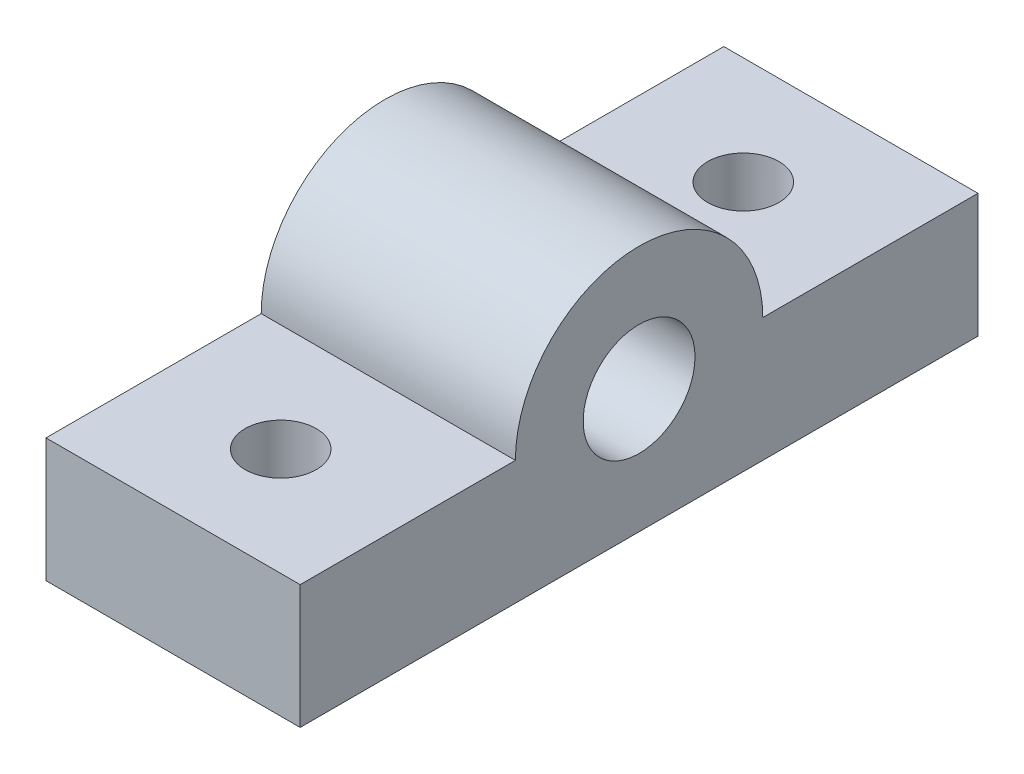
ISO-10303-21;
HEADER;
FILE_DESCRIPTION(('STEP AP214'),'2;1');
FILE_NAME('part.step','',(''),(''),'','','');
FILE_SCHEMA(('AUTOMOTIVE_DESIGN { 1 0 10303 214 1 1 1 1 }'));
ENDSEC;
DATA;
#1=APPLICATION_CONTEXT('core data for automotive mechanical design processes');
#2=APPLICATION_PROTOCOL_DEFINITION('international standard','automotive_design',2000,#1);
#3=PRODUCT_CONTEXT('',#1,'mechanical');
#4=PRODUCT('Part','Part','',(#3));
#5=PRODUCT_RELATED_PRODUCT_CATEGORY('part','',(#4));
#6=PRODUCT_DEFINITION_FORMATION('','',#4);
#7=PRODUCT_DEFINITION_CONTEXT('part definition',#1,'design');
#8=PRODUCT_DEFINITION('design','',#6,#7);
#9=PRODUCT_DEFINITION_SHAPE('','',#8);
#10=(LENGTH_UNIT() NAMED_UNIT(*) SI_UNIT(.MILLI.,.METRE.));
#11=(NAMED_UNIT(*) PLANE_ANGLE_UNIT() SI_UNIT($,.RADIAN.));
#12=(NAMED_UNIT(*) SI_UNIT($,.STERADIAN.) SOLID_ANGLE_UNIT());
#13=UNCERTAINTY_MEASURE_WITH_UNIT(LENGTH_MEASURE(1.E-05),#10,'distance_accuracy_value','');
#14=(GEOMETRIC_REPRESENTATION_CONTEXT(3) GLOBAL_UNCERTAINTY_ASSIGNED_CONTEXT((#13)) GLOBAL_UNIT_ASSIGNED_CONTEXT((#10,
#11,#12)) REPRESENTATION_CONTEXT('',''));
#15=CARTESIAN_POINT('',(0.,0.,0.));
#16=DIRECTION('',(0.,0.,1.));
#17=DIRECTION('',(1.,0.,0.));
#18=AXIS2_PLACEMENT_3D('',#15,#16,#17);
#19=CARTESIAN_POINT('',(7.5,7.3,0.));
#20=DIRECTION('',(1.,0.,0.));
#21=DIRECTION('',(0.,0.,-1.));
#22=AXIS2_PLACEMENT_3D('',#19,#20,#21);
#23=PLANE('',#22);
#24=DIRECTION('',(0.,-1.,0.));
#25=VECTOR('',#24,1.);
#26=CARTESIAN_POINT('',(7.5,0.,20.));
#27=LINE('',#26,#25);
#28=CARTESIAN_POINT('',(7.5,7.3,20.));
#29=VERTEX_POINT('',#28);
#30=CARTESIAN_POINT('',(7.5,0.,20.));
#31=VERTEX_POINT('',#30);
#32=EDGE_CURVE('E131',#29,#31,#27,.T.);
#33=ORIENTED_EDGE('',*,*,#32,.T.);
#34=DIRECTION('',(0.,0.,-1.));
#35=VECTOR('',#34,1.);
#36=CARTESIAN_POINT('',(7.5,0.,20.));
#37=LINE('',#36,#35);
#38=CARTESIAN_POINT('',(7.5,0.,-20.));
#39=VERTEX_POINT('',#38);
#40=EDGE_CURVE('E89',#31,#39,#37,.T.);
#41=ORIENTED_EDGE('',*,*,#40,.T.);
#42=DIRECTION('',(0.,1.,0.));
#43=VECTOR('',#42,1.);
#44=CARTESIAN_POINT('',(7.5,0.,-20.));
#45=LINE('',#44,#43);
#46=CARTESIAN_POINT('',(7.5,7.3,-20.));
#47=VERTEX_POINT('',#46);
#48=EDGE_CURVE('E102',#39,#47,#45,.T.);
#49=ORIENTED_EDGE('',*,*,#48,.T.);
#50=DIRECTION('',(0.,0.,1.));
#51=VECTOR('',#50,1.);
#52=CARTESIAN_POINT('',(7.5,7.3,-20.));
#53=LINE('',#52,#51);
#54=CARTESIAN_POINT('',(7.5,7.3,-7.3));
#55=VERTEX_POINT('',#54);
#56=EDGE_CURVE('E96',#47,#55,#53,.T.);
#57=ORIENTED_EDGE('',*,*,#56,.T.);
#58=CARTESIAN_POINT('',(7.5,7.3,0.));
#59=DIRECTION('',(1.,0.,0.));
#60=DIRECTION('',(0.,0.,-1.));
#61=AXIS2_PLACEMENT_3D('',#58,#59,#60);
#62=CIRCLE('',#61,7.3);
#63=CARTESIAN_POINT('',(7.5,7.3,7.3));
#64=VERTEX_POINT('',#63);
#65=EDGE_CURVE('E100',#55,#64,#62,.T.);
#66=ORIENTED_EDGE('',*,*,#65,.T.);
#67=DIRECTION('',(0.,0.,1.));
#68=VECTOR('',#67,1.);
#69=CARTESIAN_POINT('',(7.5,7.3,20.));
#70=LINE('',#69,#68);
#71=EDGE_CURVE('E52',#64,#29,#70,.T.);
#72=ORIENTED_EDGE('',*,*,#71,.T.);
#73=EDGE_LOOP('',(#33,#41,#49,#57,#66,#72));
#74=FACE_BOUND('',#73,.T.);
#75=CARTESIAN_POINT('',(7.5,7.3,0.));
#76=DIRECTION('',(1.,0.,0.));
#77=DIRECTION('',(0.,0.,-1.));
#78=AXIS2_PLACEMENT_3D('',#75,#76,#77);
#79=CIRCLE('',#78,3.3);
#80=CARTESIAN_POINT('',(7.5,7.3,-3.3));
#81=VERTEX_POINT('',#80);
#82=EDGE_CURVE('E124',#81,#81,#79,.T.);
#83=ORIENTED_EDGE('',*,*,#82,.F.);
#84=EDGE_LOOP('',(#83));
#85=FACE_BOUND('',#84,.T.);
#86=ADVANCED_FACE('F35',(#74,#85),#23,.T.);
#87=CARTESIAN_POINT('',(-7.5,7.3,0.));
#88=DIRECTION('',(1.,0.,0.));
#89=DIRECTION('',(0.,0.,-1.));
#90=AXIS2_PLACEMENT_3D('',#87,#88,#89);
#91=PLANE('',#90);
#92=DIRECTION('',(0.,-1.,0.));
#93=VECTOR('',#92,1.);
#94=CARTESIAN_POINT('',(-7.5,0.,20.));
#95=LINE('',#94,#93);
#96=CARTESIAN_POINT('',(-7.5,7.3,20.));
#97=VERTEX_POINT('',#96);
#98=CARTESIAN_POINT('',(-7.5,0.,20.));
#99=VERTEX_POINT('',#98);
#100=EDGE_CURVE('E120',#97,#99,#95,.T.);
#101=ORIENTED_EDGE('',*,*,#100,.F.);
#102=DIRECTION('',(0.,0.,1.));
#103=VECTOR('',#102,1.);
#104=CARTESIAN_POINT('',(-7.5,7.3,20.));
#105=LINE('',#104,#103);
#106=CARTESIAN_POINT('',(-7.5,7.3,7.3));
#107=VERTEX_POINT('',#106);
#108=EDGE_CURVE('E81',#107,#97,#105,.T.);
#109=ORIENTED_EDGE('',*,*,#108,.F.);
#110=CARTESIAN_POINT('',(-7.5,7.3,0.));
#111=DIRECTION('',(1.,0.,0.));
#112=DIRECTION('',(0.,0.,-1.));
#113=AXIS2_PLACEMENT_3D('',#110,#111,#112);
#114=CIRCLE('',#113,7.3);
#115=CARTESIAN_POINT('',(-7.5,7.3,-7.3));
#116=VERTEX_POINT('',#115);
#117=EDGE_CURVE('E75',#116,#107,#114,.T.);
#118=ORIENTED_EDGE('',*,*,#117,.F.);
#119=DIRECTION('',(0.,0.,1.));
#120=VECTOR('',#119,1.);
#121=CARTESIAN_POINT('',(-7.5,7.3,-20.));
#122=LINE('',#121,#120);
#123=CARTESIAN_POINT('',(-7.5,7.3,-20.));
#124=VERTEX_POINT('',#123);
#125=EDGE_CURVE('E110',#124,#116,#122,.T.);
#126=ORIENTED_EDGE('',*,*,#125,.F.);
#127=DIRECTION('',(0.,1.,0.));
#128=VECTOR('',#127,1.);
#129=CARTESIAN_POINT('',(-7.5,0.,-20.));
#130=LINE('',#129,#128);
#131=CARTESIAN_POINT('',(-7.5,0.,-20.));
#132=VERTEX_POINT('',#131);
#133=EDGE_CURVE('E126',#132,#124,#130,.T.);
#134=ORIENTED_EDGE('',*,*,#133,.F.);
#135=DIRECTION('',(0.,0.,-1.));
#136=VECTOR('',#135,1.);
#137=CARTESIAN_POINT('',(-7.5,0.,20.));
#138=LINE('',#137,#136);
#139=EDGE_CURVE('E123',#99,#132,#138,.T.);
#140=ORIENTED_EDGE('',*,*,#139,.F.);
#141=EDGE_LOOP('',(#101,#109,#118,#126,#134,#140));
#142=FACE_BOUND('',#141,.T.);
#143=CARTESIAN_POINT('',(-7.5,7.3,0.));
#144=DIRECTION('',(1.,0.,0.));
#145=DIRECTION('',(0.,0.,-1.));
#146=AXIS2_PLACEMENT_3D('',#143,#144,#145);
#147=CIRCLE('',#146,3.3);
#148=CARTESIAN_POINT('',(-7.5,7.3,-3.3));
#149=VERTEX_POINT('',#148);
#150=EDGE_CURVE('E181',#149,#149,#147,.T.);
#151=ORIENTED_EDGE('',*,*,#150,.T.);
#152=EDGE_LOOP('',(#151));
#153=FACE_BOUND('',#152,.T.);
#154=ADVANCED_FACE('F140',(#142,#153),#91,.F.);
#155=CARTESIAN_POINT('',(7.5,0.,20.));
#156=DIRECTION('',(0.,0.,-1.));
#157=DIRECTION('',(-1.,0.,0.));
#158=AXIS2_PLACEMENT_3D('',#155,#156,#157);
#159=PLANE('',#158);
#160=ORIENTED_EDGE('',*,*,#100,.T.);
#161=DIRECTION('',(-1.,0.,0.));
#162=VECTOR('',#161,1.);
#163=CARTESIAN_POINT('',(7.5,0.,20.));
#164=LINE('',#163,#162);
#165=EDGE_CURVE('E11',#31,#99,#164,.T.);
#166=ORIENTED_EDGE('',*,*,#165,.F.);
#167=ORIENTED_EDGE('',*,*,#32,.F.);
#168=DIRECTION('',(-1.,0.,0.));
#169=VECTOR('',#168,1.);
#170=CARTESIAN_POINT('',(7.5,7.3,20.));
#171=LINE('',#170,#169);
#172=EDGE_CURVE('E116',#29,#97,#171,.T.);
#173=ORIENTED_EDGE('',*,*,#172,.T.);
#174=EDGE_LOOP('',(#160,#166,#167,#173));
#175=FACE_BOUND('',#174,.T.);
#176=ADVANCED_FACE('F37',(#175),#159,.F.);
#177=CARTESIAN_POINT('',(7.5,0.,20.));
#178=DIRECTION('',(0.,1.,0.));
#179=DIRECTION('',(0.,0.,1.));
#180=AXIS2_PLACEMENT_3D('',#177,#178,#179);
#181=PLANE('',#180);
#182=CARTESIAN_POINT('',(0.,0.,13.65));
#183=DIRECTION('',(0.,1.,0.));
#184=DIRECTION('',(0.,0.,1.));
#185=AXIS2_PLACEMENT_3D('',#182,#183,#184);
#186=CIRCLE('',#185,2.1);
#187=CARTESIAN_POINT('',(0.,0.,15.75));
#188=VERTEX_POINT('',#187);
#189=EDGE_CURVE('E179',#188,#188,#186,.F.);
#190=ORIENTED_EDGE('',*,*,#189,.F.);
#191=EDGE_LOOP('',(#190));
#192=FACE_BOUND('',#191,.T.);
#193=CARTESIAN_POINT('',(0.,0.,-13.65));
#194=DIRECTION('',(0.,1.,0.));
#195=DIRECTION('',(0.,0.,1.));
#196=AXIS2_PLACEMENT_3D('',#193,#194,#195);
#197=CIRCLE('',#196,2.1);
#198=CARTESIAN_POINT('',(0.,0.,-11.55));
#199=VERTEX_POINT('',#198);
#200=EDGE_CURVE('E185',#199,#199,#197,.F.);
#201=ORIENTED_EDGE('',*,*,#200,.F.);
#202=EDGE_LOOP('',(#201));
#203=FACE_BOUND('',#202,.T.);
#204=ORIENTED_EDGE('',*,*,#139,.T.);
#205=DIRECTION('',(-1.,0.,0.));
#206=VECTOR('',#205,1.);
#207=CARTESIAN_POINT('',(7.5,0.,-20.));
#208=LINE('',#207,#206);
#209=EDGE_CURVE('E44',#39,#132,#208,.T.);
#210=ORIENTED_EDGE('',*,*,#209,.F.);
#211=ORIENTED_EDGE('',*,*,#40,.F.);
#212=ORIENTED_EDGE('',*,*,#165,.T.);
#213=EDGE_LOOP('',(#204,#210,#211,#212));
#214=FACE_BOUND('',#213,.T.);
#215=ADVANCED_FACE('F202',(#192,#203,#214),#181,.F.);
#216=CARTESIAN_POINT('',(7.5,0.,-20.));
#217=DIRECTION('',(0.,0.,1.));
#218=DIRECTION('',(1.,0.,0.));
#219=AXIS2_PLACEMENT_3D('',#216,#217,#218);
#220=PLANE('',#219);
#221=ORIENTED_EDGE('',*,*,#133,.T.);
#222=DIRECTION('',(-1.,0.,0.));
#223=VECTOR('',#222,1.);
#224=CARTESIAN_POINT('',(7.5,7.3,-20.));
#225=LINE('',#224,#223);
#226=EDGE_CURVE('E111',#47,#124,#225,.T.);
#227=ORIENTED_EDGE('',*,*,#226,.F.);
#228=ORIENTED_EDGE('',*,*,#48,.F.);
#229=ORIENTED_EDGE('',*,*,#209,.T.);
#230=EDGE_LOOP('',(#221,#227,#228,#229));
#231=FACE_BOUND('',#230,.T.);
#232=ADVANCED_FACE('F137',(#231),#220,.F.);
#233=CARTESIAN_POINT('',(7.5,7.3,-20.));
#234=DIRECTION('',(0.,-1.,0.));
#235=DIRECTION('',(0.,0.,-1.));
#236=AXIS2_PLACEMENT_3D('',#233,#234,#235);
#237=PLANE('',#236);
#238=CARTESIAN_POINT('',(0.,7.3,-13.65));
#239=DIRECTION('',(0.,1.,0.));
#240=DIRECTION('',(0.,0.,-1.));
#241=AXIS2_PLACEMENT_3D('',#238,#239,#240);
#242=CIRCLE('',#241,2.1);
#243=CARTESIAN_POINT('',(0.,7.3,-15.75));
#244=VERTEX_POINT('',#243);
#245=EDGE_CURVE('E188',#244,#244,#242,.T.);
#246=ORIENTED_EDGE('',*,*,#245,.F.);
#247=EDGE_LOOP('',(#246));
#248=FACE_BOUND('',#247,.T.);
#249=ORIENTED_EDGE('',*,*,#125,.T.);
#250=DIRECTION('',(-1.,0.,0.));
#251=VECTOR('',#250,1.);
#252=CARTESIAN_POINT('',(7.5,7.3,-7.3));
#253=LINE('',#252,#251);
#254=EDGE_CURVE('E107',#55,#116,#253,.T.);
#255=ORIENTED_EDGE('',*,*,#254,.F.);
#256=ORIENTED_EDGE('',*,*,#56,.F.);
#257=ORIENTED_EDGE('',*,*,#226,.T.);
#258=EDGE_LOOP('',(#249,#255,#256,#257));
#259=FACE_BOUND('',#258,.T.);
#260=ADVANCED_FACE('F108',(#248,#259),#237,.F.);
#261=CARTESIAN_POINT('',(7.5,7.3,0.));
#262=DIRECTION('',(-1.,0.,0.));
#263=DIRECTION('',(0.,0.,1.));
#264=AXIS2_PLACEMENT_3D('',#261,#262,#263);
#265=CYLINDRICAL_SURFACE('',#264,7.3);
#266=ORIENTED_EDGE('',*,*,#117,.T.);
#267=DIRECTION('',(-1.,0.,0.));
#268=VECTOR('',#267,1.);
#269=CARTESIAN_POINT('',(7.5,7.3,7.3));
#270=LINE('',#269,#268);
#271=EDGE_CURVE('E112',#64,#107,#270,.T.);
#272=ORIENTED_EDGE('',*,*,#271,.F.);
#273=ORIENTED_EDGE('',*,*,#65,.F.);
#274=ORIENTED_EDGE('',*,*,#254,.T.);
#275=EDGE_LOOP('',(#266,#272,#273,#274));
#276=FACE_BOUND('',#275,.T.);
#277=ADVANCED_FACE('F114',(#276),#265,.T.);
#278=CARTESIAN_POINT('',(7.5,7.3,20.));
#279=DIRECTION('',(0.,-1.,0.));
#280=DIRECTION('',(0.,0.,-1.));
#281=AXIS2_PLACEMENT_3D('',#278,#279,#280);
#282=PLANE('',#281);
#283=CARTESIAN_POINT('',(0.,7.3,13.65));
#284=DIRECTION('',(0.,1.,0.));
#285=DIRECTION('',(0.,0.,1.));
#286=AXIS2_PLACEMENT_3D('',#283,#284,#285);
#287=CIRCLE('',#286,2.1);
#288=CARTESIAN_POINT('',(0.,7.3,15.75));
#289=VERTEX_POINT('',#288);
#290=EDGE_CURVE('E176',#289,#289,#287,.T.);
#291=ORIENTED_EDGE('',*,*,#290,.F.);
#292=EDGE_LOOP('',(#291));
#293=FACE_BOUND('',#292,.T.);
#294=ORIENTED_EDGE('',*,*,#108,.T.);
#295=ORIENTED_EDGE('',*,*,#172,.F.);
#296=ORIENTED_EDGE('',*,*,#71,.F.);
#297=ORIENTED_EDGE('',*,*,#271,.T.);
#298=EDGE_LOOP('',(#294,#295,#296,#297));
#299=FACE_BOUND('',#298,.T.);
#300=ADVANCED_FACE('F145',(#293,#299),#282,.F.);
#301=CARTESIAN_POINT('',(7.5,7.3,0.));
#302=DIRECTION('',(-1.,0.,0.));
#303=DIRECTION('',(0.,0.,1.));
#304=AXIS2_PLACEMENT_3D('',#301,#302,#303);
#305=CYLINDRICAL_SURFACE('',#304,3.3);
#306=ORIENTED_EDGE('',*,*,#82,.T.);
#307=EDGE_LOOP('',(#306));
#308=FACE_BOUND('',#307,.T.);
#309=ORIENTED_EDGE('',*,*,#150,.F.);
#310=EDGE_LOOP('',(#309));
#311=FACE_BOUND('',#310,.T.);
#312=ADVANCED_FACE('F147',(#308,#311),#305,.F.);
#313=CARTESIAN_POINT('',(0.,-0.001000000000001,13.65));
#314=DIRECTION('',(0.,1.,0.));
#315=DIRECTION('',(0.,0.,1.));
#316=AXIS2_PLACEMENT_3D('',#313,#314,#315);
#317=CYLINDRICAL_SURFACE('',#316,2.1);
#318=ORIENTED_EDGE('',*,*,#290,.T.);
#319=EDGE_LOOP('',(#318));
#320=FACE_BOUND('',#319,.T.);
#321=ORIENTED_EDGE('',*,*,#189,.T.);
#322=EDGE_LOOP('',(#321));
#323=FACE_BOUND('',#322,.T.);
#324=ADVANCED_FACE('F154',(#320,#323),#317,.F.);
#325=CARTESIAN_POINT('',(0.,-0.00100000000000447,-13.65));
#326=DIRECTION('',(0.,1.,0.));
#327=DIRECTION('',(0.,0.,1.));
#328=AXIS2_PLACEMENT_3D('',#325,#326,#327);
#329=CYLINDRICAL_SURFACE('',#328,2.1);
#330=ORIENTED_EDGE('',*,*,#245,.T.);
#331=EDGE_LOOP('',(#330));
#332=FACE_BOUND('',#331,.T.);
#333=ORIENTED_EDGE('',*,*,#200,.T.);
#334=EDGE_LOOP('',(#333));
#335=FACE_BOUND('',#334,.T.);
#336=ADVANCED_FACE('F166',(#332,#335),#329,.F.);
#337=CLOSED_SHELL('',(#86,#154,#176,#215,#232,#260,#277,#300,#312,#324,#336));
#338=MANIFOLD_SOLID_BREP('B2',#337);
#339=ADVANCED_BREP_SHAPE_REPRESENTATION('',(#18,#338),#14);
#340=SHAPE_DEFINITION_REPRESENTATION(#9,#339);
ENDSEC;
END-ISO-10303-21;
